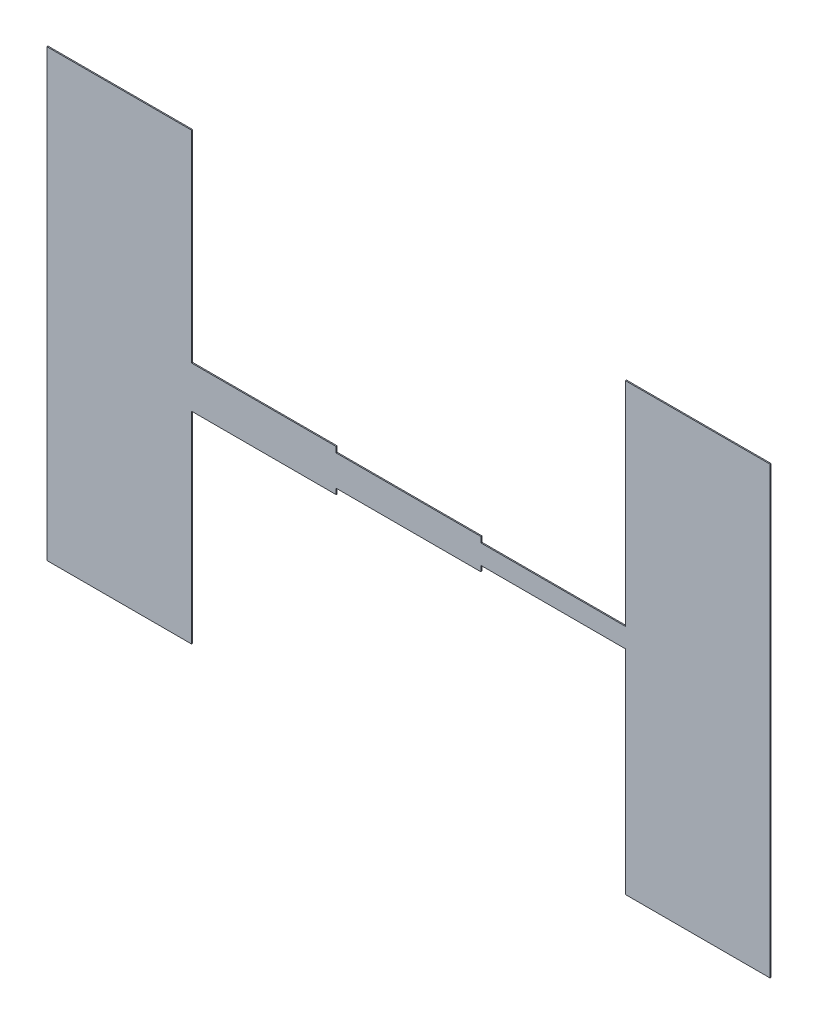
ISO-10303-21;
HEADER;
FILE_DESCRIPTION(('STEP AP214'),'2;1');
FILE_NAME('part.step','',(''),(''),'','','');
FILE_SCHEMA(('AUTOMOTIVE_DESIGN { 1 0 10303 214 1 1 1 1 }'));
ENDSEC;
DATA;
#1=APPLICATION_CONTEXT('core data for automotive mechanical design processes');
#2=APPLICATION_PROTOCOL_DEFINITION('international standard','automotive_design',2000,#1);
#3=PRODUCT_CONTEXT('',#1,'mechanical');
#4=PRODUCT('Part','Part','',(#3));
#5=PRODUCT_RELATED_PRODUCT_CATEGORY('part','',(#4));
#6=PRODUCT_DEFINITION_FORMATION('','',#4);
#7=PRODUCT_DEFINITION_CONTEXT('part definition',#1,'design');
#8=PRODUCT_DEFINITION('design','',#6,#7);
#9=PRODUCT_DEFINITION_SHAPE('','',#8);
#10=(LENGTH_UNIT() NAMED_UNIT(*) SI_UNIT(.MILLI.,.METRE.));
#11=(NAMED_UNIT(*) PLANE_ANGLE_UNIT() SI_UNIT($,.RADIAN.));
#12=(NAMED_UNIT(*) SI_UNIT($,.STERADIAN.) SOLID_ANGLE_UNIT());
#13=UNCERTAINTY_MEASURE_WITH_UNIT(LENGTH_MEASURE(1.E-05),#10,'distance_accuracy_value','');
#14=(GEOMETRIC_REPRESENTATION_CONTEXT(3) GLOBAL_UNCERTAINTY_ASSIGNED_CONTEXT((#13)) GLOBAL_UNIT_ASSIGNED_CONTEXT((#10,
#11,#12)) REPRESENTATION_CONTEXT('',''));
#15=CARTESIAN_POINT('',(0.,0.,0.));
#16=DIRECTION('',(0.,0.,1.));
#17=DIRECTION('',(1.,0.,0.));
#18=AXIS2_PLACEMENT_3D('',#15,#16,#17);
#19=CARTESIAN_POINT('',(4550.,0.,10.));
#20=DIRECTION('',(-1.,0.,0.));
#21=DIRECTION('',(0.,0.,1.));
#22=AXIS2_PLACEMENT_3D('',#19,#20,#21);
#23=PLANE('',#22);
#24=DIRECTION('',(0.,1.,0.));
#25=VECTOR('',#24,1.);
#26=CARTESIAN_POINT('',(4550.,0.,0.));
#27=LINE('',#26,#25);
#28=CARTESIAN_POINT('',(4550.,-2000.,0.));
#29=VERTEX_POINT('',#28);
#30=CARTESIAN_POINT('',(4550.,-87.4999999999999,0.));
#31=VERTEX_POINT('',#30);
#32=EDGE_CURVE('E220',#29,#31,#27,.T.);
#33=ORIENTED_EDGE('',*,*,#32,.F.);
#34=DIRECTION('',(0.,0.,-1.));
#35=VECTOR('',#34,1.);
#36=CARTESIAN_POINT('',(4550.,-2000.,10.));
#37=LINE('',#36,#35);
#38=CARTESIAN_POINT('',(4550.,-2000.,10.));
#39=VERTEX_POINT('',#38);
#40=EDGE_CURVE('E11',#39,#29,#37,.T.);
#41=ORIENTED_EDGE('',*,*,#40,.F.);
#42=DIRECTION('',(0.,1.,0.));
#43=VECTOR('',#42,1.);
#44=CARTESIAN_POINT('',(4550.,0.,10.));
#45=LINE('',#44,#43);
#46=CARTESIAN_POINT('',(4550.,-87.4999999999999,10.));
#47=VERTEX_POINT('',#46);
#48=EDGE_CURVE('E289',#39,#47,#45,.T.);
#49=ORIENTED_EDGE('',*,*,#48,.T.);
#50=DIRECTION('',(0.,0.,-1.));
#51=VECTOR('',#50,1.);
#52=CARTESIAN_POINT('',(4550.,-87.4999999999999,10.));
#53=LINE('',#52,#51);
#54=EDGE_CURVE('E64',#47,#31,#53,.T.);
#55=ORIENTED_EDGE('',*,*,#54,.T.);
#56=EDGE_LOOP('',(#33,#41,#49,#55));
#57=FACE_BOUND('',#56,.T.);
#58=ADVANCED_FACE('F47',(#57),#23,.T.);
#59=CARTESIAN_POINT('',(3.41607084500048E-13,-2000.,10.));
#60=DIRECTION('',(0.,-1.,0.));
#61=DIRECTION('',(1.,0.,0.));
#62=AXIS2_PLACEMENT_3D('',#59,#60,#61);
#63=PLANE('',#62);
#64=DIRECTION('',(-1.,0.,0.));
#65=VECTOR('',#64,1.);
#66=CARTESIAN_POINT('',(3.41607084500048E-13,-2000.,0.));
#67=LINE('',#66,#65);
#68=CARTESIAN_POINT('',(5850.,-2000.,0.));
#69=VERTEX_POINT('',#68);
#70=EDGE_CURVE('E223',#69,#29,#67,.T.);
#71=ORIENTED_EDGE('',*,*,#70,.F.);
#72=DIRECTION('',(0.,0.,-1.));
#73=VECTOR('',#72,1.);
#74=CARTESIAN_POINT('',(5850.,-2000.,10.));
#75=LINE('',#74,#73);
#76=CARTESIAN_POINT('',(5850.,-2000.,10.));
#77=VERTEX_POINT('',#76);
#78=EDGE_CURVE('E56',#77,#69,#75,.T.);
#79=ORIENTED_EDGE('',*,*,#78,.F.);
#80=DIRECTION('',(-1.,0.,0.));
#81=VECTOR('',#80,1.);
#82=CARTESIAN_POINT('',(3.41607084500048E-13,-2000.,10.));
#83=LINE('',#82,#81);
#84=EDGE_CURVE('E359',#77,#39,#83,.T.);
#85=ORIENTED_EDGE('',*,*,#84,.T.);
#86=ORIENTED_EDGE('',*,*,#40,.T.);
#87=EDGE_LOOP('',(#71,#79,#85,#86));
#88=FACE_BOUND('',#87,.T.);
#89=ADVANCED_FACE('F358',(#88),#63,.T.);
#90=CARTESIAN_POINT('',(5850.,0.,10.));
#91=DIRECTION('',(-1.,0.,0.));
#92=DIRECTION('',(0.,0.,1.));
#93=AXIS2_PLACEMENT_3D('',#90,#91,#92);
#94=PLANE('',#93);
#95=DIRECTION('',(0.,1.,0.));
#96=VECTOR('',#95,1.);
#97=CARTESIAN_POINT('',(5850.,0.,0.));
#98=LINE('',#97,#96);
#99=CARTESIAN_POINT('',(5850.,2000.,0.));
#100=VERTEX_POINT('',#99);
#101=EDGE_CURVE('E227',#69,#100,#98,.T.);
#102=ORIENTED_EDGE('',*,*,#101,.T.);
#103=DIRECTION('',(0.,0.,-1.));
#104=VECTOR('',#103,1.);
#105=CARTESIAN_POINT('',(5850.,2000.,10.));
#106=LINE('',#105,#104);
#107=CARTESIAN_POINT('',(5850.,2000.,10.));
#108=VERTEX_POINT('',#107);
#109=EDGE_CURVE('E341',#108,#100,#106,.T.);
#110=ORIENTED_EDGE('',*,*,#109,.F.);
#111=DIRECTION('',(0.,1.,0.));
#112=VECTOR('',#111,1.);
#113=CARTESIAN_POINT('',(5850.,0.,10.));
#114=LINE('',#113,#112);
#115=EDGE_CURVE('E350',#77,#108,#114,.T.);
#116=ORIENTED_EDGE('',*,*,#115,.F.);
#117=ORIENTED_EDGE('',*,*,#78,.T.);
#118=EDGE_LOOP('',(#102,#110,#116,#117));
#119=FACE_BOUND('',#118,.T.);
#120=ADVANCED_FACE('F348',(#119),#94,.F.);
#121=CARTESIAN_POINT('',(0.,2000.,10.));
#122=DIRECTION('',(0.,-1.,0.));
#123=DIRECTION('',(0.,0.,-1.));
#124=AXIS2_PLACEMENT_3D('',#121,#122,#123);
#125=PLANE('',#124);
#126=DIRECTION('',(-1.,0.,0.));
#127=VECTOR('',#126,1.);
#128=CARTESIAN_POINT('',(0.,2000.,0.));
#129=LINE('',#128,#127);
#130=CARTESIAN_POINT('',(4550.,2000.,0.));
#131=VERTEX_POINT('',#130);
#132=EDGE_CURVE('E230',#100,#131,#129,.T.);
#133=ORIENTED_EDGE('',*,*,#132,.T.);
#134=DIRECTION('',(0.,0.,-1.));
#135=VECTOR('',#134,1.);
#136=CARTESIAN_POINT('',(4550.,2000.,10.));
#137=LINE('',#136,#135);
#138=CARTESIAN_POINT('',(4550.,2000.,10.));
#139=VERTEX_POINT('',#138);
#140=EDGE_CURVE('E338',#139,#131,#137,.T.);
#141=ORIENTED_EDGE('',*,*,#140,.F.);
#142=DIRECTION('',(-1.,0.,0.));
#143=VECTOR('',#142,1.);
#144=CARTESIAN_POINT('',(0.,2000.,10.));
#145=LINE('',#144,#143);
#146=EDGE_CURVE('E609',#108,#139,#145,.T.);
#147=ORIENTED_EDGE('',*,*,#146,.F.);
#148=ORIENTED_EDGE('',*,*,#109,.T.);
#149=EDGE_LOOP('',(#133,#141,#147,#148));
#150=FACE_BOUND('',#149,.T.);
#151=ADVANCED_FACE('F377',(#150),#125,.F.);
#152=CARTESIAN_POINT('',(4550.,0.,10.));
#153=DIRECTION('',(-1.,0.,0.));
#154=DIRECTION('',(0.,0.,1.));
#155=AXIS2_PLACEMENT_3D('',#152,#153,#154);
#156=PLANE('',#155);
#157=DIRECTION('',(0.,1.,0.));
#158=VECTOR('',#157,1.);
#159=CARTESIAN_POINT('',(4550.,0.,0.));
#160=LINE('',#159,#158);
#161=CARTESIAN_POINT('',(4550.,87.5000000000001,0.));
#162=VERTEX_POINT('',#161);
#163=EDGE_CURVE('E234',#162,#131,#160,.T.);
#164=ORIENTED_EDGE('',*,*,#163,.F.);
#165=DIRECTION('',(0.,0.,-1.));
#166=VECTOR('',#165,1.);
#167=CARTESIAN_POINT('',(4550.,87.5000000000001,10.));
#168=LINE('',#167,#166);
#169=CARTESIAN_POINT('',(4550.,87.5000000000001,10.));
#170=VERTEX_POINT('',#169);
#171=EDGE_CURVE('E335',#170,#162,#168,.T.);
#172=ORIENTED_EDGE('',*,*,#171,.F.);
#173=DIRECTION('',(0.,1.,0.));
#174=VECTOR('',#173,1.);
#175=CARTESIAN_POINT('',(4550.,0.,10.));
#176=LINE('',#175,#174);
#177=EDGE_CURVE('E607',#170,#139,#176,.T.);
#178=ORIENTED_EDGE('',*,*,#177,.T.);
#179=ORIENTED_EDGE('',*,*,#140,.T.);
#180=EDGE_LOOP('',(#164,#172,#178,#179));
#181=FACE_BOUND('',#180,.T.);
#182=ADVANCED_FACE('F382',(#181),#156,.T.);
#183=CARTESIAN_POINT('',(0.,87.4999999999994,10.));
#184=DIRECTION('',(0.,-1.,0.));
#185=DIRECTION('',(1.,0.,0.));
#186=AXIS2_PLACEMENT_3D('',#183,#184,#185);
#187=PLANE('',#186);
#188=DIRECTION('',(-1.,0.,0.));
#189=VECTOR('',#188,1.);
#190=CARTESIAN_POINT('',(0.,87.4999999999994,0.));
#191=LINE('',#190,#189);
#192=CARTESIAN_POINT('',(3250.,87.4999999999999,0.));
#193=VERTEX_POINT('',#192);
#194=EDGE_CURVE('E238',#162,#193,#191,.T.);
#195=ORIENTED_EDGE('',*,*,#194,.T.);
#196=DIRECTION('',(0.,0.,-1.));
#197=VECTOR('',#196,1.);
#198=CARTESIAN_POINT('',(3250.,87.4999999999999,10.));
#199=LINE('',#198,#197);
#200=CARTESIAN_POINT('',(3250.,87.4999999999999,10.));
#201=VERTEX_POINT('',#200);
#202=EDGE_CURVE('E331',#201,#193,#199,.T.);
#203=ORIENTED_EDGE('',*,*,#202,.F.);
#204=DIRECTION('',(-1.,0.,0.));
#205=VECTOR('',#204,1.);
#206=CARTESIAN_POINT('',(0.,87.4999999999994,10.));
#207=LINE('',#206,#205);
#208=EDGE_CURVE('E602',#170,#201,#207,.T.);
#209=ORIENTED_EDGE('',*,*,#208,.F.);
#210=ORIENTED_EDGE('',*,*,#171,.T.);
#211=EDGE_LOOP('',(#195,#203,#209,#210));
#212=FACE_BOUND('',#211,.T.);
#213=ADVANCED_FACE('F386',(#212),#187,.F.);
#214=CARTESIAN_POINT('',(3250.,0.,10.));
#215=DIRECTION('',(-1.,0.,0.));
#216=DIRECTION('',(0.,0.,1.));
#217=AXIS2_PLACEMENT_3D('',#214,#215,#216);
#218=PLANE('',#217);
#219=DIRECTION('',(0.,1.,0.));
#220=VECTOR('',#219,1.);
#221=CARTESIAN_POINT('',(3250.,0.,0.));
#222=LINE('',#221,#220);
#223=CARTESIAN_POINT('',(3250.,137.5,0.));
#224=VERTEX_POINT('',#223);
#225=EDGE_CURVE('E241',#193,#224,#222,.T.);
#226=ORIENTED_EDGE('',*,*,#225,.T.);
#227=DIRECTION('',(0.,0.,-1.));
#228=VECTOR('',#227,1.);
#229=CARTESIAN_POINT('',(3250.,137.5,10.));
#230=LINE('',#229,#228);
#231=CARTESIAN_POINT('',(3250.,137.5,10.));
#232=VERTEX_POINT('',#231);
#233=EDGE_CURVE('E327',#232,#224,#230,.T.);
#234=ORIENTED_EDGE('',*,*,#233,.F.);
#235=DIRECTION('',(0.,1.,0.));
#236=VECTOR('',#235,1.);
#237=CARTESIAN_POINT('',(3250.,0.,10.));
#238=LINE('',#237,#236);
#239=EDGE_CURVE('E599',#201,#232,#238,.T.);
#240=ORIENTED_EDGE('',*,*,#239,.F.);
#241=ORIENTED_EDGE('',*,*,#202,.T.);
#242=EDGE_LOOP('',(#226,#234,#240,#241));
#243=FACE_BOUND('',#242,.T.);
#244=ADVANCED_FACE('F390',(#243),#218,.F.);
#245=CARTESIAN_POINT('',(0.,137.5,10.));
#246=DIRECTION('',(0.,-1.,0.));
#247=DIRECTION('',(1.,0.,0.));
#248=AXIS2_PLACEMENT_3D('',#245,#246,#247);
#249=PLANE('',#248);
#250=DIRECTION('',(-1.,0.,0.));
#251=VECTOR('',#250,1.);
#252=CARTESIAN_POINT('',(0.,137.5,0.));
#253=LINE('',#252,#251);
#254=CARTESIAN_POINT('',(1950.,137.5,0.));
#255=VERTEX_POINT('',#254);
#256=EDGE_CURVE('E244',#224,#255,#253,.T.);
#257=ORIENTED_EDGE('',*,*,#256,.T.);
#258=DIRECTION('',(0.,0.,-1.));
#259=VECTOR('',#258,1.);
#260=CARTESIAN_POINT('',(1950.,137.5,10.));
#261=LINE('',#260,#259);
#262=CARTESIAN_POINT('',(1950.,137.5,10.));
#263=VERTEX_POINT('',#262);
#264=EDGE_CURVE('E323',#263,#255,#261,.T.);
#265=ORIENTED_EDGE('',*,*,#264,.F.);
#266=DIRECTION('',(-1.,0.,0.));
#267=VECTOR('',#266,1.);
#268=CARTESIAN_POINT('',(0.,137.5,10.));
#269=LINE('',#268,#267);
#270=EDGE_CURVE('E597',#232,#263,#269,.T.);
#271=ORIENTED_EDGE('',*,*,#270,.F.);
#272=ORIENTED_EDGE('',*,*,#233,.T.);
#273=EDGE_LOOP('',(#257,#265,#271,#272));
#274=FACE_BOUND('',#273,.T.);
#275=ADVANCED_FACE('F394',(#274),#249,.F.);
#276=CARTESIAN_POINT('',(1950.,0.,10.));
#277=DIRECTION('',(-1.,0.,0.));
#278=DIRECTION('',(0.,0.,1.));
#279=AXIS2_PLACEMENT_3D('',#276,#277,#278);
#280=PLANE('',#279);
#281=DIRECTION('',(0.,1.,0.));
#282=VECTOR('',#281,1.);
#283=CARTESIAN_POINT('',(1950.,0.,0.));
#284=LINE('',#283,#282);
#285=CARTESIAN_POINT('',(1950.,187.5,0.));
#286=VERTEX_POINT('',#285);
#287=EDGE_CURVE('E247',#255,#286,#284,.T.);
#288=ORIENTED_EDGE('',*,*,#287,.T.);
#289=DIRECTION('',(0.,0.,-1.));
#290=VECTOR('',#289,1.);
#291=CARTESIAN_POINT('',(1950.,187.5,10.));
#292=LINE('',#291,#290);
#293=CARTESIAN_POINT('',(1950.,187.5,10.));
#294=VERTEX_POINT('',#293);
#295=EDGE_CURVE('E319',#294,#286,#292,.T.);
#296=ORIENTED_EDGE('',*,*,#295,.F.);
#297=DIRECTION('',(0.,1.,0.));
#298=VECTOR('',#297,1.);
#299=CARTESIAN_POINT('',(1950.,0.,10.));
#300=LINE('',#299,#298);
#301=EDGE_CURVE('E590',#263,#294,#300,.T.);
#302=ORIENTED_EDGE('',*,*,#301,.F.);
#303=ORIENTED_EDGE('',*,*,#264,.T.);
#304=EDGE_LOOP('',(#288,#296,#302,#303));
#305=FACE_BOUND('',#304,.T.);
#306=ADVANCED_FACE('F398',(#305),#280,.F.);
#307=CARTESIAN_POINT('',(0.,187.499999999999,10.));
#308=DIRECTION('',(0.,-1.,0.));
#309=DIRECTION('',(1.,0.,0.));
#310=AXIS2_PLACEMENT_3D('',#307,#308,#309);
#311=PLANE('',#310);
#312=DIRECTION('',(-1.,0.,0.));
#313=VECTOR('',#312,1.);
#314=CARTESIAN_POINT('',(0.,187.499999999999,0.));
#315=LINE('',#314,#313);
#316=CARTESIAN_POINT('',(650.,187.5,0.));
#317=VERTEX_POINT('',#316);
#318=EDGE_CURVE('E250',#286,#317,#315,.T.);
#319=ORIENTED_EDGE('',*,*,#318,.T.);
#320=DIRECTION('',(0.,0.,-1.));
#321=VECTOR('',#320,1.);
#322=CARTESIAN_POINT('',(650.,187.5,10.));
#323=LINE('',#322,#321);
#324=CARTESIAN_POINT('',(650.,187.5,10.));
#325=VERTEX_POINT('',#324);
#326=EDGE_CURVE('E315',#325,#317,#323,.T.);
#327=ORIENTED_EDGE('',*,*,#326,.F.);
#328=DIRECTION('',(-1.,0.,0.));
#329=VECTOR('',#328,1.);
#330=CARTESIAN_POINT('',(0.,187.499999999999,10.));
#331=LINE('',#330,#329);
#332=EDGE_CURVE('E587',#294,#325,#331,.T.);
#333=ORIENTED_EDGE('',*,*,#332,.F.);
#334=ORIENTED_EDGE('',*,*,#295,.T.);
#335=EDGE_LOOP('',(#319,#327,#333,#334));
#336=FACE_BOUND('',#335,.T.);
#337=ADVANCED_FACE('F402',(#336),#311,.F.);
#338=CARTESIAN_POINT('',(650.,0.,10.));
#339=DIRECTION('',(-1.,0.,0.));
#340=DIRECTION('',(0.,0.,1.));
#341=AXIS2_PLACEMENT_3D('',#338,#339,#340);
#342=PLANE('',#341);
#343=DIRECTION('',(0.,1.,0.));
#344=VECTOR('',#343,1.);
#345=CARTESIAN_POINT('',(650.,0.,0.));
#346=LINE('',#345,#344);
#347=CARTESIAN_POINT('',(650.,2000.,0.));
#348=VERTEX_POINT('',#347);
#349=EDGE_CURVE('E253',#317,#348,#346,.T.);
#350=ORIENTED_EDGE('',*,*,#349,.T.);
#351=DIRECTION('',(0.,0.,-1.));
#352=VECTOR('',#351,1.);
#353=CARTESIAN_POINT('',(650.,2000.,10.));
#354=LINE('',#353,#352);
#355=CARTESIAN_POINT('',(650.,2000.,10.));
#356=VERTEX_POINT('',#355);
#357=EDGE_CURVE('E312',#356,#348,#354,.T.);
#358=ORIENTED_EDGE('',*,*,#357,.F.);
#359=DIRECTION('',(0.,1.,0.));
#360=VECTOR('',#359,1.);
#361=CARTESIAN_POINT('',(650.,0.,10.));
#362=LINE('',#361,#360);
#363=EDGE_CURVE('E585',#325,#356,#362,.T.);
#364=ORIENTED_EDGE('',*,*,#363,.F.);
#365=ORIENTED_EDGE('',*,*,#326,.T.);
#366=EDGE_LOOP('',(#350,#358,#364,#365));
#367=FACE_BOUND('',#366,.T.);
#368=ADVANCED_FACE('F406',(#367),#342,.F.);
#369=CARTESIAN_POINT('',(0.,2000.,10.));
#370=DIRECTION('',(0.,1.,0.));
#371=DIRECTION('',(0.,0.,1.));
#372=AXIS2_PLACEMENT_3D('',#369,#370,#371);
#373=PLANE('',#372);
#374=DIRECTION('',(1.,0.,0.));
#375=VECTOR('',#374,1.);
#376=CARTESIAN_POINT('',(0.,2000.,0.));
#377=LINE('',#376,#375);
#378=CARTESIAN_POINT('',(-650.,2000.,0.));
#379=VERTEX_POINT('',#378);
#380=EDGE_CURVE('E257',#379,#348,#377,.T.);
#381=ORIENTED_EDGE('',*,*,#380,.F.);
#382=DIRECTION('',(0.,0.,-1.));
#383=VECTOR('',#382,1.);
#384=CARTESIAN_POINT('',(-650.,2000.,10.));
#385=LINE('',#384,#383);
#386=CARTESIAN_POINT('',(-650.,2000.,10.));
#387=VERTEX_POINT('',#386);
#388=EDGE_CURVE('E309',#387,#379,#385,.T.);
#389=ORIENTED_EDGE('',*,*,#388,.F.);
#390=DIRECTION('',(1.,0.,0.));
#391=VECTOR('',#390,1.);
#392=CARTESIAN_POINT('',(0.,2000.,10.));
#393=LINE('',#392,#391);
#394=EDGE_CURVE('E630',#387,#356,#393,.T.);
#395=ORIENTED_EDGE('',*,*,#394,.T.);
#396=ORIENTED_EDGE('',*,*,#357,.T.);
#397=EDGE_LOOP('',(#381,#389,#395,#396));
#398=FACE_BOUND('',#397,.T.);
#399=ADVANCED_FACE('F410',(#398),#373,.T.);
#400=CARTESIAN_POINT('',(-650.,0.,10.));
#401=DIRECTION('',(-1.,0.,0.));
#402=DIRECTION('',(0.,0.,1.));
#403=AXIS2_PLACEMENT_3D('',#400,#401,#402);
#404=PLANE('',#403);
#405=DIRECTION('',(0.,1.,0.));
#406=VECTOR('',#405,1.);
#407=CARTESIAN_POINT('',(-650.,0.,0.));
#408=LINE('',#407,#406);
#409=CARTESIAN_POINT('',(-650.,-2000.,0.));
#410=VERTEX_POINT('',#409);
#411=EDGE_CURVE('E261',#410,#379,#408,.T.);
#412=ORIENTED_EDGE('',*,*,#411,.F.);
#413=DIRECTION('',(0.,0.,-1.));
#414=VECTOR('',#413,1.);
#415=CARTESIAN_POINT('',(-650.,-2000.,10.));
#416=LINE('',#415,#414);
#417=CARTESIAN_POINT('',(-650.,-2000.,10.));
#418=VERTEX_POINT('',#417);
#419=EDGE_CURVE('E306',#418,#410,#416,.T.);
#420=ORIENTED_EDGE('',*,*,#419,.F.);
#421=DIRECTION('',(0.,1.,0.));
#422=VECTOR('',#421,1.);
#423=CARTESIAN_POINT('',(-650.,0.,10.));
#424=LINE('',#423,#422);
#425=EDGE_CURVE('E576',#418,#387,#424,.T.);
#426=ORIENTED_EDGE('',*,*,#425,.T.);
#427=ORIENTED_EDGE('',*,*,#388,.T.);
#428=EDGE_LOOP('',(#412,#420,#426,#427));
#429=FACE_BOUND('',#428,.T.);
#430=ADVANCED_FACE('F414',(#429),#404,.T.);
#431=CARTESIAN_POINT('',(0.,-2000.,10.));
#432=DIRECTION('',(0.,1.,0.));
#433=DIRECTION('',(0.,0.,1.));
#434=AXIS2_PLACEMENT_3D('',#431,#432,#433);
#435=PLANE('',#434);
#436=DIRECTION('',(1.,0.,0.));
#437=VECTOR('',#436,1.);
#438=CARTESIAN_POINT('',(0.,-2000.,0.));
#439=LINE('',#438,#437);
#440=CARTESIAN_POINT('',(650.,-2000.,0.));
#441=VERTEX_POINT('',#440);
#442=EDGE_CURVE('E265',#410,#441,#439,.T.);
#443=ORIENTED_EDGE('',*,*,#442,.T.);
#444=DIRECTION('',(0.,0.,-1.));
#445=VECTOR('',#444,1.);
#446=CARTESIAN_POINT('',(650.,-2000.,10.));
#447=LINE('',#446,#445);
#448=CARTESIAN_POINT('',(650.,-2000.,10.));
#449=VERTEX_POINT('',#448);
#450=EDGE_CURVE('E302',#449,#441,#447,.T.);
#451=ORIENTED_EDGE('',*,*,#450,.F.);
#452=DIRECTION('',(1.,0.,0.));
#453=VECTOR('',#452,1.);
#454=CARTESIAN_POINT('',(0.,-2000.,10.));
#455=LINE('',#454,#453);
#456=EDGE_CURVE('E635',#418,#449,#455,.T.);
#457=ORIENTED_EDGE('',*,*,#456,.F.);
#458=ORIENTED_EDGE('',*,*,#419,.T.);
#459=EDGE_LOOP('',(#443,#451,#457,#458));
#460=FACE_BOUND('',#459,.T.);
#461=ADVANCED_FACE('F418',(#460),#435,.F.);
#462=CARTESIAN_POINT('',(650.,0.,10.));
#463=DIRECTION('',(-1.,0.,0.));
#464=DIRECTION('',(0.,-1.,0.));
#465=AXIS2_PLACEMENT_3D('',#462,#463,#464);
#466=PLANE('',#465);
#467=DIRECTION('',(0.,1.,0.));
#468=VECTOR('',#467,1.);
#469=CARTESIAN_POINT('',(650.,0.,0.));
#470=LINE('',#469,#468);
#471=CARTESIAN_POINT('',(650.,-187.5,0.));
#472=VERTEX_POINT('',#471);
#473=EDGE_CURVE('E268',#441,#472,#470,.T.);
#474=ORIENTED_EDGE('',*,*,#473,.T.);
#475=DIRECTION('',(0.,0.,-1.));
#476=VECTOR('',#475,1.);
#477=CARTESIAN_POINT('',(650.,-187.5,10.));
#478=LINE('',#477,#476);
#479=CARTESIAN_POINT('',(650.,-187.5,10.));
#480=VERTEX_POINT('',#479);
#481=EDGE_CURVE('E299',#480,#472,#478,.T.);
#482=ORIENTED_EDGE('',*,*,#481,.F.);
#483=DIRECTION('',(0.,1.,0.));
#484=VECTOR('',#483,1.);
#485=CARTESIAN_POINT('',(650.,0.,10.));
#486=LINE('',#485,#484);
#487=EDGE_CURVE('E638',#449,#480,#486,.T.);
#488=ORIENTED_EDGE('',*,*,#487,.F.);
#489=ORIENTED_EDGE('',*,*,#450,.T.);
#490=EDGE_LOOP('',(#474,#482,#488,#489));
#491=FACE_BOUND('',#490,.T.);
#492=ADVANCED_FACE('F422',(#491),#466,.F.);
#493=CARTESIAN_POINT('',(0.,-187.500000000001,10.));
#494=DIRECTION('',(0.,-1.,0.));
#495=DIRECTION('',(1.,0.,0.));
#496=AXIS2_PLACEMENT_3D('',#493,#494,#495);
#497=PLANE('',#496);
#498=DIRECTION('',(-1.,0.,0.));
#499=VECTOR('',#498,1.);
#500=CARTESIAN_POINT('',(0.,-187.500000000001,0.));
#501=LINE('',#500,#499);
#502=CARTESIAN_POINT('',(1950.,-187.5,0.));
#503=VERTEX_POINT('',#502);
#504=EDGE_CURVE('E272',#503,#472,#501,.T.);
#505=ORIENTED_EDGE('',*,*,#504,.F.);
#506=DIRECTION('',(0.,0.,-1.));
#507=VECTOR('',#506,1.);
#508=CARTESIAN_POINT('',(1950.,-187.5,10.));
#509=LINE('',#508,#507);
#510=CARTESIAN_POINT('',(1950.,-187.5,10.));
#511=VERTEX_POINT('',#510);
#512=EDGE_CURVE('E296',#511,#503,#509,.T.);
#513=ORIENTED_EDGE('',*,*,#512,.F.);
#514=DIRECTION('',(-1.,0.,0.));
#515=VECTOR('',#514,1.);
#516=CARTESIAN_POINT('',(0.,-187.500000000001,10.));
#517=LINE('',#516,#515);
#518=EDGE_CURVE('E214',#511,#480,#517,.T.);
#519=ORIENTED_EDGE('',*,*,#518,.T.);
#520=ORIENTED_EDGE('',*,*,#481,.T.);
#521=EDGE_LOOP('',(#505,#513,#519,#520));
#522=FACE_BOUND('',#521,.T.);
#523=ADVANCED_FACE('F426',(#522),#497,.T.);
#524=CARTESIAN_POINT('',(1950.,0.,10.));
#525=DIRECTION('',(-1.,0.,0.));
#526=DIRECTION('',(0.,0.,1.));
#527=AXIS2_PLACEMENT_3D('',#524,#525,#526);
#528=PLANE('',#527);
#529=DIRECTION('',(0.,1.,0.));
#530=VECTOR('',#529,1.);
#531=CARTESIAN_POINT('',(1950.,0.,0.));
#532=LINE('',#531,#530);
#533=CARTESIAN_POINT('',(1950.,-137.5,0.));
#534=VERTEX_POINT('',#533);
#535=EDGE_CURVE('E276',#503,#534,#532,.T.);
#536=ORIENTED_EDGE('',*,*,#535,.T.);
#537=DIRECTION('',(0.,0.,-1.));
#538=VECTOR('',#537,1.);
#539=CARTESIAN_POINT('',(1950.,-137.5,10.));
#540=LINE('',#539,#538);
#541=CARTESIAN_POINT('',(1950.,-137.5,10.));
#542=VERTEX_POINT('',#541);
#543=EDGE_CURVE('E197',#542,#534,#540,.T.);
#544=ORIENTED_EDGE('',*,*,#543,.F.);
#545=DIRECTION('',(0.,1.,0.));
#546=VECTOR('',#545,1.);
#547=CARTESIAN_POINT('',(1950.,0.,10.));
#548=LINE('',#547,#546);
#549=EDGE_CURVE('E209',#511,#542,#548,.T.);
#550=ORIENTED_EDGE('',*,*,#549,.F.);
#551=ORIENTED_EDGE('',*,*,#512,.T.);
#552=EDGE_LOOP('',(#536,#544,#550,#551));
#553=FACE_BOUND('',#552,.T.);
#554=ADVANCED_FACE('F430',(#553),#528,.F.);
#555=CARTESIAN_POINT('',(0.,-137.5,10.));
#556=DIRECTION('',(0.,-1.,0.));
#557=DIRECTION('',(1.,0.,0.));
#558=AXIS2_PLACEMENT_3D('',#555,#556,#557);
#559=PLANE('',#558);
#560=DIRECTION('',(-1.,0.,0.));
#561=VECTOR('',#560,1.);
#562=CARTESIAN_POINT('',(0.,-137.5,0.));
#563=LINE('',#562,#561);
#564=CARTESIAN_POINT('',(3250.,-137.5,0.));
#565=VERTEX_POINT('',#564);
#566=EDGE_CURVE('E193',#565,#534,#563,.T.);
#567=ORIENTED_EDGE('',*,*,#566,.F.);
#568=DIRECTION('',(0.,0.,-1.));
#569=VECTOR('',#568,1.);
#570=CARTESIAN_POINT('',(3250.,-137.5,10.));
#571=LINE('',#570,#569);
#572=CARTESIAN_POINT('',(3250.,-137.5,10.));
#573=VERTEX_POINT('',#572);
#574=EDGE_CURVE('E187',#573,#565,#571,.T.);
#575=ORIENTED_EDGE('',*,*,#574,.F.);
#576=DIRECTION('',(-1.,0.,0.));
#577=VECTOR('',#576,1.);
#578=CARTESIAN_POINT('',(0.,-137.5,10.));
#579=LINE('',#578,#577);
#580=EDGE_CURVE('E191',#573,#542,#579,.T.);
#581=ORIENTED_EDGE('',*,*,#580,.T.);
#582=ORIENTED_EDGE('',*,*,#543,.T.);
#583=EDGE_LOOP('',(#567,#575,#581,#582));
#584=FACE_BOUND('',#583,.T.);
#585=ADVANCED_FACE('F189',(#584),#559,.T.);
#586=CARTESIAN_POINT('',(3250.,0.,10.));
#587=DIRECTION('',(-1.,0.,0.));
#588=DIRECTION('',(0.,0.,1.));
#589=AXIS2_PLACEMENT_3D('',#586,#587,#588);
#590=PLANE('',#589);
#591=DIRECTION('',(0.,1.,0.));
#592=VECTOR('',#591,1.);
#593=CARTESIAN_POINT('',(3250.,0.,0.));
#594=LINE('',#593,#592);
#595=CARTESIAN_POINT('',(3250.,-87.5,0.));
#596=VERTEX_POINT('',#595);
#597=EDGE_CURVE('E282',#565,#596,#594,.T.);
#598=ORIENTED_EDGE('',*,*,#597,.T.);
#599=DIRECTION('',(0.,0.,-1.));
#600=VECTOR('',#599,1.);
#601=CARTESIAN_POINT('',(3250.,-87.5,10.));
#602=LINE('',#601,#600);
#603=CARTESIAN_POINT('',(3250.,-87.5,10.));
#604=VERTEX_POINT('',#603);
#605=EDGE_CURVE('E126',#604,#596,#602,.T.);
#606=ORIENTED_EDGE('',*,*,#605,.F.);
#607=DIRECTION('',(0.,1.,0.));
#608=VECTOR('',#607,1.);
#609=CARTESIAN_POINT('',(3250.,0.,10.));
#610=LINE('',#609,#608);
#611=EDGE_CURVE('E199',#573,#604,#610,.T.);
#612=ORIENTED_EDGE('',*,*,#611,.F.);
#613=ORIENTED_EDGE('',*,*,#574,.T.);
#614=EDGE_LOOP('',(#598,#606,#612,#613));
#615=FACE_BOUND('',#614,.T.);
#616=ADVANCED_FACE('F200',(#615),#590,.F.);
#617=CARTESIAN_POINT('',(0.,-87.5000000000005,10.));
#618=DIRECTION('',(0.,-1.,0.));
#619=DIRECTION('',(1.,0.,0.));
#620=AXIS2_PLACEMENT_3D('',#617,#618,#619);
#621=PLANE('',#620);
#622=DIRECTION('',(-1.,0.,0.));
#623=VECTOR('',#622,1.);
#624=CARTESIAN_POINT('',(0.,-87.5000000000005,0.));
#625=LINE('',#624,#623);
#626=EDGE_CURVE('E285',#31,#596,#625,.T.);
#627=ORIENTED_EDGE('',*,*,#626,.F.);
#628=ORIENTED_EDGE('',*,*,#54,.F.);
#629=DIRECTION('',(-1.,0.,0.));
#630=VECTOR('',#629,1.);
#631=CARTESIAN_POINT('',(0.,-87.5000000000005,10.));
#632=LINE('',#631,#630);
#633=EDGE_CURVE('E204',#47,#604,#632,.T.);
#634=ORIENTED_EDGE('',*,*,#633,.T.);
#635=ORIENTED_EDGE('',*,*,#605,.T.);
#636=EDGE_LOOP('',(#627,#628,#634,#635));
#637=FACE_BOUND('',#636,.T.);
#638=ADVANCED_FACE('F360',(#637),#621,.T.);
#639=CARTESIAN_POINT('',(0.,0.,10.));
#640=DIRECTION('',(0.,0.,1.));
#641=DIRECTION('',(1.,0.,0.));
#642=AXIS2_PLACEMENT_3D('',#639,#640,#641);
#643=PLANE('',#642);
#644=ORIENTED_EDGE('',*,*,#48,.F.);
#645=ORIENTED_EDGE('',*,*,#84,.F.);
#646=ORIENTED_EDGE('',*,*,#115,.T.);
#647=ORIENTED_EDGE('',*,*,#146,.T.);
#648=ORIENTED_EDGE('',*,*,#177,.F.);
#649=ORIENTED_EDGE('',*,*,#208,.T.);
#650=ORIENTED_EDGE('',*,*,#239,.T.);
#651=ORIENTED_EDGE('',*,*,#270,.T.);
#652=ORIENTED_EDGE('',*,*,#301,.T.);
#653=ORIENTED_EDGE('',*,*,#332,.T.);
#654=ORIENTED_EDGE('',*,*,#363,.T.);
#655=ORIENTED_EDGE('',*,*,#394,.F.);
#656=ORIENTED_EDGE('',*,*,#425,.F.);
#657=ORIENTED_EDGE('',*,*,#456,.T.);
#658=ORIENTED_EDGE('',*,*,#487,.T.);
#659=ORIENTED_EDGE('',*,*,#518,.F.);
#660=ORIENTED_EDGE('',*,*,#549,.T.);
#661=ORIENTED_EDGE('',*,*,#580,.F.);
#662=ORIENTED_EDGE('',*,*,#611,.T.);
#663=ORIENTED_EDGE('',*,*,#633,.F.);
#664=EDGE_LOOP('',(#644,#645,#646,#647,#648,#649,#650,#651,#652,#653,#654,#655,#656,#657,#658,
#659,#660,#661,#662,#663));
#665=FACE_BOUND('',#664,.T.);
#666=ADVANCED_FACE('F206',(#665),#643,.T.);
#667=CARTESIAN_POINT('',(0.,0.,0.));
#668=DIRECTION('',(0.,0.,1.));
#669=DIRECTION('',(1.,0.,0.));
#670=AXIS2_PLACEMENT_3D('',#667,#668,#669);
#671=PLANE('',#670);
#672=ORIENTED_EDGE('',*,*,#32,.T.);
#673=ORIENTED_EDGE('',*,*,#626,.T.);
#674=ORIENTED_EDGE('',*,*,#597,.F.);
#675=ORIENTED_EDGE('',*,*,#566,.T.);
#676=ORIENTED_EDGE('',*,*,#535,.F.);
#677=ORIENTED_EDGE('',*,*,#504,.T.);
#678=ORIENTED_EDGE('',*,*,#473,.F.);
#679=ORIENTED_EDGE('',*,*,#442,.F.);
#680=ORIENTED_EDGE('',*,*,#411,.T.);
#681=ORIENTED_EDGE('',*,*,#380,.T.);
#682=ORIENTED_EDGE('',*,*,#349,.F.);
#683=ORIENTED_EDGE('',*,*,#318,.F.);
#684=ORIENTED_EDGE('',*,*,#287,.F.);
#685=ORIENTED_EDGE('',*,*,#256,.F.);
#686=ORIENTED_EDGE('',*,*,#225,.F.);
#687=ORIENTED_EDGE('',*,*,#194,.F.);
#688=ORIENTED_EDGE('',*,*,#163,.T.);
#689=ORIENTED_EDGE('',*,*,#132,.F.);
#690=ORIENTED_EDGE('',*,*,#101,.F.);
#691=ORIENTED_EDGE('',*,*,#70,.T.);
#692=EDGE_LOOP('',(#672,#673,#674,#675,#676,#677,#678,#679,#680,#681,#682,#683,#684,#685,#686,
#687,#688,#689,#690,#691));
#693=FACE_BOUND('',#692,.T.);
#694=ADVANCED_FACE('F357',(#693),#671,.F.);
#695=CLOSED_SHELL('',(#58,#89,#120,#151,#182,#213,#244,#275,#306,#337,#368,#399,#430,#461,#492,
#523,#554,#585,#616,#638,#666,#694));
#696=MANIFOLD_SOLID_BREP('B2',#695);
#697=ADVANCED_BREP_SHAPE_REPRESENTATION('',(#18,#696),#14);
#698=SHAPE_DEFINITION_REPRESENTATION(#9,#697);
ENDSEC;
END-ISO-10303-21;
